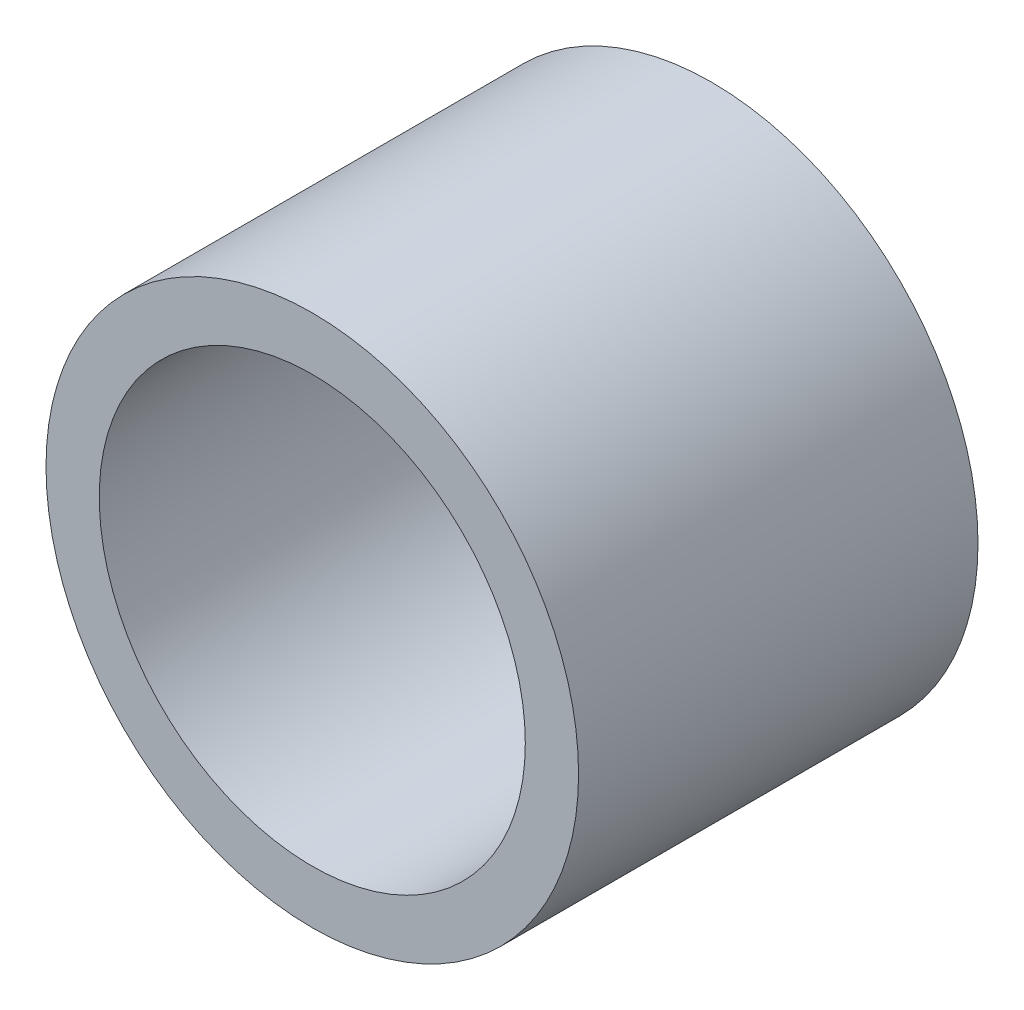
ISO-10303-21;
HEADER;
FILE_DESCRIPTION(('STEP AP214'),'2;1');
FILE_NAME('part.step','',(''),(''),'','','');
FILE_SCHEMA(('AUTOMOTIVE_DESIGN { 1 0 10303 214 1 1 1 1 }'));
ENDSEC;
DATA;
#1=APPLICATION_CONTEXT('core data for automotive mechanical design processes');
#2=APPLICATION_PROTOCOL_DEFINITION('international standard','automotive_design',2000,#1);
#3=PRODUCT_CONTEXT('',#1,'mechanical');
#4=PRODUCT('Part','Part','',(#3));
#5=PRODUCT_RELATED_PRODUCT_CATEGORY('part','',(#4));
#6=PRODUCT_DEFINITION_FORMATION('','',#4);
#7=PRODUCT_DEFINITION_CONTEXT('part definition',#1,'design');
#8=PRODUCT_DEFINITION('design','',#6,#7);
#9=PRODUCT_DEFINITION_SHAPE('','',#8);
#10=(LENGTH_UNIT() NAMED_UNIT(*) SI_UNIT(.MILLI.,.METRE.));
#11=(NAMED_UNIT(*) PLANE_ANGLE_UNIT() SI_UNIT($,.RADIAN.));
#12=(NAMED_UNIT(*) SI_UNIT($,.STERADIAN.) SOLID_ANGLE_UNIT());
#13=UNCERTAINTY_MEASURE_WITH_UNIT(LENGTH_MEASURE(1.E-05),#10,'distance_accuracy_value','');
#14=(GEOMETRIC_REPRESENTATION_CONTEXT(3) GLOBAL_UNCERTAINTY_ASSIGNED_CONTEXT((#13)) GLOBAL_UNIT_ASSIGNED_CONTEXT((#10,
#11,#12)) REPRESENTATION_CONTEXT('',''));
#15=CARTESIAN_POINT('',(0.,0.,0.));
#16=DIRECTION('',(0.,0.,1.));
#17=DIRECTION('',(1.,0.,0.));
#18=AXIS2_PLACEMENT_3D('',#15,#16,#17);
#19=CARTESIAN_POINT('',(0.,0.,15.));
#20=DIRECTION('',(0.,0.,1.));
#21=DIRECTION('',(1.,0.,0.));
#22=AXIS2_PLACEMENT_3D('',#19,#20,#21);
#23=PLANE('',#22);
#24=CARTESIAN_POINT('',(0.,0.,15.));
#25=DIRECTION('',(0.,0.,1.));
#26=DIRECTION('',(1.,0.,0.));
#27=AXIS2_PLACEMENT_3D('',#24,#25,#26);
#28=CIRCLE('',#27,10.);
#29=CARTESIAN_POINT('',(10.,0.,15.));
#30=VERTEX_POINT('',#29);
#31=EDGE_CURVE('E10',#30,#30,#28,.T.);
#32=ORIENTED_EDGE('',*,*,#31,.T.);
#33=EDGE_LOOP('',(#32));
#34=FACE_BOUND('',#33,.T.);
#35=CARTESIAN_POINT('',(0.,0.,15.));
#36=DIRECTION('',(0.,0.,1.));
#37=DIRECTION('',(1.,0.,0.));
#38=AXIS2_PLACEMENT_3D('',#35,#36,#37);
#39=CIRCLE('',#38,8.);
#40=CARTESIAN_POINT('',(8.,0.,15.));
#41=VERTEX_POINT('',#40);
#42=EDGE_CURVE('E46',#41,#41,#39,.T.);
#43=ORIENTED_EDGE('',*,*,#42,.F.);
#44=EDGE_LOOP('',(#43));
#45=FACE_BOUND('',#44,.T.);
#46=ADVANCED_FACE('F35',(#34,#45),#23,.T.);
#47=CARTESIAN_POINT('',(0.,0.,0.));
#48=DIRECTION('',(0.,0.,1.));
#49=DIRECTION('',(1.,0.,0.));
#50=AXIS2_PLACEMENT_3D('',#47,#48,#49);
#51=PLANE('',#50);
#52=CARTESIAN_POINT('',(0.,0.,0.));
#53=DIRECTION('',(0.,0.,1.));
#54=DIRECTION('',(1.,0.,0.));
#55=AXIS2_PLACEMENT_3D('',#52,#53,#54);
#56=CIRCLE('',#55,10.);
#57=CARTESIAN_POINT('',(10.,0.,0.));
#58=VERTEX_POINT('',#57);
#59=EDGE_CURVE('E39',#58,#58,#56,.T.);
#60=ORIENTED_EDGE('',*,*,#59,.F.);
#61=EDGE_LOOP('',(#60));
#62=FACE_BOUND('',#61,.T.);
#63=CARTESIAN_POINT('',(0.,0.,0.));
#64=DIRECTION('',(0.,0.,1.));
#65=DIRECTION('',(1.,0.,0.));
#66=AXIS2_PLACEMENT_3D('',#63,#64,#65);
#67=CIRCLE('',#66,8.);
#68=CARTESIAN_POINT('',(8.,0.,0.));
#69=VERTEX_POINT('',#68);
#70=EDGE_CURVE('E48',#69,#69,#67,.T.);
#71=ORIENTED_EDGE('',*,*,#70,.T.);
#72=EDGE_LOOP('',(#71));
#73=FACE_BOUND('',#72,.T.);
#74=ADVANCED_FACE('F58',(#62,#73),#51,.F.);
#75=CARTESIAN_POINT('',(0.,0.,15.));
#76=DIRECTION('',(0.,0.,-1.));
#77=DIRECTION('',(-1.,0.,0.));
#78=AXIS2_PLACEMENT_3D('',#75,#76,#77);
#79=CYLINDRICAL_SURFACE('',#78,10.);
#80=ORIENTED_EDGE('',*,*,#31,.F.);
#81=EDGE_LOOP('',(#80));
#82=FACE_BOUND('',#81,.T.);
#83=ORIENTED_EDGE('',*,*,#59,.T.);
#84=EDGE_LOOP('',(#83));
#85=FACE_BOUND('',#84,.T.);
#86=ADVANCED_FACE('F37',(#82,#85),#79,.T.);
#87=CARTESIAN_POINT('',(0.,0.,15.));
#88=DIRECTION('',(0.,0.,-1.));
#89=DIRECTION('',(-1.,0.,0.));
#90=AXIS2_PLACEMENT_3D('',#87,#88,#89);
#91=CYLINDRICAL_SURFACE('',#90,8.);
#92=ORIENTED_EDGE('',*,*,#42,.T.);
#93=EDGE_LOOP('',(#92));
#94=FACE_BOUND('',#93,.T.);
#95=ORIENTED_EDGE('',*,*,#70,.F.);
#96=EDGE_LOOP('',(#95));
#97=FACE_BOUND('',#96,.T.);
#98=ADVANCED_FACE('F54',(#94,#97),#91,.F.);
#99=CLOSED_SHELL('',(#46,#74,#86,#98));
#100=MANIFOLD_SOLID_BREP('B2',#99);
#101=ADVANCED_BREP_SHAPE_REPRESENTATION('',(#18,#100),#14);
#102=SHAPE_DEFINITION_REPRESENTATION(#9,#101);
ENDSEC;
END-ISO-10303-21;
